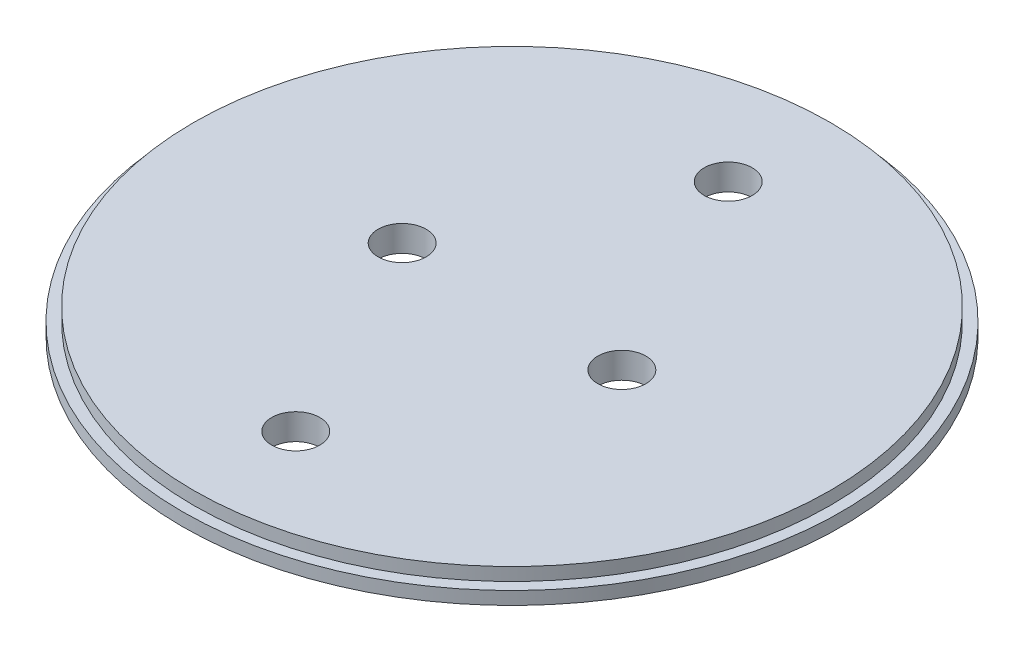
ISO-10303-21;
HEADER;
FILE_DESCRIPTION(('STEP AP214'),'2;1');
FILE_NAME('part.step','',(''),(''),'','','');
FILE_SCHEMA(('AUTOMOTIVE_DESIGN { 1 0 10303 214 1 1 1 1 }'));
ENDSEC;
DATA;
#1=APPLICATION_CONTEXT('core data for automotive mechanical design processes');
#2=APPLICATION_PROTOCOL_DEFINITION('international standard','automotive_design',2000,#1);
#3=PRODUCT_CONTEXT('',#1,'mechanical');
#4=PRODUCT('Part','Part','',(#3));
#5=PRODUCT_RELATED_PRODUCT_CATEGORY('part','',(#4));
#6=PRODUCT_DEFINITION_FORMATION('','',#4);
#7=PRODUCT_DEFINITION_CONTEXT('part definition',#1,'design');
#8=PRODUCT_DEFINITION('design','',#6,#7);
#9=PRODUCT_DEFINITION_SHAPE('','',#8);
#10=(LENGTH_UNIT() NAMED_UNIT(*) SI_UNIT(.MILLI.,.METRE.));
#11=(NAMED_UNIT(*) PLANE_ANGLE_UNIT() SI_UNIT($,.RADIAN.));
#12=(NAMED_UNIT(*) SI_UNIT($,.STERADIAN.) SOLID_ANGLE_UNIT());
#13=UNCERTAINTY_MEASURE_WITH_UNIT(LENGTH_MEASURE(1.E-05),#10,'distance_accuracy_value','');
#14=(GEOMETRIC_REPRESENTATION_CONTEXT(3) GLOBAL_UNCERTAINTY_ASSIGNED_CONTEXT((#13)) GLOBAL_UNIT_ASSIGNED_CONTEXT((#10,
#11,#12)) REPRESENTATION_CONTEXT('',''));
#15=CARTESIAN_POINT('',(0.,0.,0.));
#16=DIRECTION('',(0.,0.,1.));
#17=DIRECTION('',(1.,0.,0.));
#18=AXIS2_PLACEMENT_3D('',#15,#16,#17);
#19=CARTESIAN_POINT('',(0.,3.,50.));
#20=DIRECTION('',(0.,-1.,0.));
#21=DIRECTION('',(0.,0.,-1.));
#22=AXIS2_PLACEMENT_3D('',#19,#20,#21);
#23=CYLINDRICAL_SURFACE('',#22,5.55625);
#24=CARTESIAN_POINT('',(0.,3.,50.));
#25=DIRECTION('',(0.,1.,0.));
#26=DIRECTION('',(0.,0.,1.));
#27=AXIS2_PLACEMENT_3D('',#24,#25,#26);
#28=CIRCLE('',#27,5.55625);
#29=CARTESIAN_POINT('',(0.,3.,55.55625));
#30=VERTEX_POINT('',#29);
#31=EDGE_CURVE('E54',#30,#30,#28,.T.);
#32=ORIENTED_EDGE('',*,*,#31,.T.);
#33=EDGE_LOOP('',(#32));
#34=FACE_BOUND('',#33,.T.);
#35=CARTESIAN_POINT('',(0.,-3.,50.));
#36=DIRECTION('',(0.,1.,0.));
#37=DIRECTION('',(0.,0.,1.));
#38=AXIS2_PLACEMENT_3D('',#35,#36,#37);
#39=CIRCLE('',#38,5.55625);
#40=CARTESIAN_POINT('',(0.,-3.,55.55625));
#41=VERTEX_POINT('',#40);
#42=EDGE_CURVE('E82',#41,#41,#39,.T.);
#43=ORIENTED_EDGE('',*,*,#42,.F.);
#44=EDGE_LOOP('',(#43));
#45=FACE_BOUND('',#44,.T.);
#46=ADVANCED_FACE('F45',(#34,#45),#23,.F.);
#47=CARTESIAN_POINT('',(0.,3.,-50.));
#48=DIRECTION('',(0.,-1.,0.));
#49=DIRECTION('',(0.,0.,-1.));
#50=AXIS2_PLACEMENT_3D('',#47,#48,#49);
#51=CYLINDRICAL_SURFACE('',#50,5.55625);
#52=CARTESIAN_POINT('',(0.,3.,-50.));
#53=DIRECTION('',(0.,1.,0.));
#54=DIRECTION('',(0.,0.,1.));
#55=AXIS2_PLACEMENT_3D('',#52,#53,#54);
#56=CIRCLE('',#55,5.55625);
#57=CARTESIAN_POINT('',(0.,3.,-44.44375));
#58=VERTEX_POINT('',#57);
#59=EDGE_CURVE('E59',#58,#58,#56,.T.);
#60=ORIENTED_EDGE('',*,*,#59,.T.);
#61=EDGE_LOOP('',(#60));
#62=FACE_BOUND('',#61,.T.);
#63=CARTESIAN_POINT('',(0.,-3.,-50.));
#64=DIRECTION('',(0.,1.,0.));
#65=DIRECTION('',(0.,0.,1.));
#66=AXIS2_PLACEMENT_3D('',#63,#64,#65);
#67=CIRCLE('',#66,5.55625);
#68=CARTESIAN_POINT('',(0.,-3.,-44.44375));
#69=VERTEX_POINT('',#68);
#70=EDGE_CURVE('E86',#69,#69,#67,.T.);
#71=ORIENTED_EDGE('',*,*,#70,.F.);
#72=EDGE_LOOP('',(#71));
#73=FACE_BOUND('',#72,.T.);
#74=ADVANCED_FACE('F113',(#62,#73),#51,.F.);
#75=CARTESIAN_POINT('',(-25.4,3.,0.));
#76=DIRECTION('',(0.,-1.,0.));
#77=DIRECTION('',(0.,0.,-1.));
#78=AXIS2_PLACEMENT_3D('',#75,#76,#77);
#79=CYLINDRICAL_SURFACE('',#78,5.55625);
#80=CARTESIAN_POINT('',(-25.4,3.,0.));
#81=DIRECTION('',(0.,1.,0.));
#82=DIRECTION('',(0.,0.,1.));
#83=AXIS2_PLACEMENT_3D('',#80,#81,#82);
#84=CIRCLE('',#83,5.55625);
#85=CARTESIAN_POINT('',(-25.4,3.,5.55625));
#86=VERTEX_POINT('',#85);
#87=EDGE_CURVE('E65',#86,#86,#84,.T.);
#88=ORIENTED_EDGE('',*,*,#87,.T.);
#89=EDGE_LOOP('',(#88));
#90=FACE_BOUND('',#89,.T.);
#91=CARTESIAN_POINT('',(-25.4,-3.,0.));
#92=DIRECTION('',(0.,1.,0.));
#93=DIRECTION('',(0.,0.,1.));
#94=AXIS2_PLACEMENT_3D('',#91,#92,#93);
#95=CIRCLE('',#94,5.55625);
#96=CARTESIAN_POINT('',(-25.4,-3.,5.55625));
#97=VERTEX_POINT('',#96);
#98=EDGE_CURVE('E90',#97,#97,#95,.T.);
#99=ORIENTED_EDGE('',*,*,#98,.F.);
#100=EDGE_LOOP('',(#99));
#101=FACE_BOUND('',#100,.T.);
#102=ADVANCED_FACE('F103',(#90,#101),#79,.F.);
#103=CARTESIAN_POINT('',(25.4,3.,0.));
#104=DIRECTION('',(0.,-1.,0.));
#105=DIRECTION('',(0.,0.,-1.));
#106=AXIS2_PLACEMENT_3D('',#103,#104,#105);
#107=CYLINDRICAL_SURFACE('',#106,5.55625);
#108=CARTESIAN_POINT('',(25.4,3.,0.));
#109=DIRECTION('',(0.,1.,0.));
#110=DIRECTION('',(0.,0.,1.));
#111=AXIS2_PLACEMENT_3D('',#108,#109,#110);
#112=CIRCLE('',#111,5.55625);
#113=CARTESIAN_POINT('',(25.4,3.,5.55625));
#114=VERTEX_POINT('',#113);
#115=EDGE_CURVE('E69',#114,#114,#112,.T.);
#116=ORIENTED_EDGE('',*,*,#115,.T.);
#117=EDGE_LOOP('',(#116));
#118=FACE_BOUND('',#117,.T.);
#119=CARTESIAN_POINT('',(25.4,-3.,0.));
#120=DIRECTION('',(0.,1.,0.));
#121=DIRECTION('',(0.,0.,1.));
#122=AXIS2_PLACEMENT_3D('',#119,#120,#121);
#123=CIRCLE('',#122,5.55625);
#124=CARTESIAN_POINT('',(25.4,-3.,5.55625));
#125=VERTEX_POINT('',#124);
#126=EDGE_CURVE('E77',#125,#125,#123,.T.);
#127=ORIENTED_EDGE('',*,*,#126,.F.);
#128=EDGE_LOOP('',(#127));
#129=FACE_BOUND('',#128,.T.);
#130=ADVANCED_FACE('F47',(#118,#129),#107,.F.);
#131=CARTESIAN_POINT('',(0.,3.,0.));
#132=DIRECTION('',(0.,-1.,0.));
#133=DIRECTION('',(0.,0.,-1.));
#134=AXIS2_PLACEMENT_3D('',#131,#132,#133);
#135=CYLINDRICAL_SURFACE('',#134,73.65);
#136=CARTESIAN_POINT('',(0.,3.,0.));
#137=DIRECTION('',(0.,1.,0.));
#138=DIRECTION('',(0.,0.,1.));
#139=AXIS2_PLACEMENT_3D('',#136,#137,#138);
#140=CIRCLE('',#139,73.65);
#141=CARTESIAN_POINT('',(0.,3.,73.65));
#142=VERTEX_POINT('',#141);
#143=EDGE_CURVE('E10',#142,#142,#140,.T.);
#144=ORIENTED_EDGE('',*,*,#143,.F.);
#145=EDGE_LOOP('',(#144));
#146=FACE_BOUND('',#145,.T.);
#147=CARTESIAN_POINT('',(0.,0.,0.));
#148=DIRECTION('',(0.,1.,0.));
#149=DIRECTION('',(0.,0.,1.));
#150=AXIS2_PLACEMENT_3D('',#147,#148,#149);
#151=CIRCLE('',#150,73.65);
#152=CARTESIAN_POINT('',(0.,0.,73.65));
#153=VERTEX_POINT('',#152);
#154=EDGE_CURVE('E49',#153,#153,#151,.T.);
#155=ORIENTED_EDGE('',*,*,#154,.T.);
#156=EDGE_LOOP('',(#155));
#157=FACE_BOUND('',#156,.T.);
#158=ADVANCED_FACE('F102',(#146,#157),#135,.T.);
#159=CARTESIAN_POINT('',(0.,3.,0.));
#160=DIRECTION('',(0.,1.,0.));
#161=DIRECTION('',(0.,0.,1.));
#162=AXIS2_PLACEMENT_3D('',#159,#160,#161);
#163=PLANE('',#162);
#164=ORIENTED_EDGE('',*,*,#115,.F.);
#165=EDGE_LOOP('',(#164));
#166=FACE_BOUND('',#165,.T.);
#167=ORIENTED_EDGE('',*,*,#87,.F.);
#168=EDGE_LOOP('',(#167));
#169=FACE_BOUND('',#168,.T.);
#170=ORIENTED_EDGE('',*,*,#59,.F.);
#171=EDGE_LOOP('',(#170));
#172=FACE_BOUND('',#171,.T.);
#173=ORIENTED_EDGE('',*,*,#31,.F.);
#174=EDGE_LOOP('',(#173));
#175=FACE_BOUND('',#174,.T.);
#176=ORIENTED_EDGE('',*,*,#143,.T.);
#177=EDGE_LOOP('',(#176));
#178=FACE_BOUND('',#177,.T.);
#179=ADVANCED_FACE('F110',(#166,#169,#172,#175,#178),#163,.T.);
#180=CARTESIAN_POINT('',(0.,-3.,0.));
#181=DIRECTION('',(0.,1.,0.));
#182=DIRECTION('',(0.,0.,1.));
#183=AXIS2_PLACEMENT_3D('',#180,#181,#182);
#184=CYLINDRICAL_SURFACE('',#183,76.2);
#185=CARTESIAN_POINT('',(0.,-3.,0.));
#186=DIRECTION('',(0.,1.,0.));
#187=DIRECTION('',(0.,0.,1.));
#188=AXIS2_PLACEMENT_3D('',#185,#186,#187);
#189=CIRCLE('',#188,76.2);
#190=CARTESIAN_POINT('',(0.,-3.,76.2));
#191=VERTEX_POINT('',#190);
#192=EDGE_CURVE('E78',#191,#191,#189,.T.);
#193=ORIENTED_EDGE('',*,*,#192,.T.);
#194=EDGE_LOOP('',(#193));
#195=FACE_BOUND('',#194,.T.);
#196=CARTESIAN_POINT('',(0.,0.,0.));
#197=DIRECTION('',(0.,1.,0.));
#198=DIRECTION('',(0.,0.,1.));
#199=AXIS2_PLACEMENT_3D('',#196,#197,#198);
#200=CIRCLE('',#199,76.2);
#201=CARTESIAN_POINT('',(0.,0.,76.2));
#202=VERTEX_POINT('',#201);
#203=EDGE_CURVE('E73',#202,#202,#200,.T.);
#204=ORIENTED_EDGE('',*,*,#203,.F.);
#205=EDGE_LOOP('',(#204));
#206=FACE_BOUND('',#205,.T.);
#207=ADVANCED_FACE('F128',(#195,#206),#184,.T.);
#208=CARTESIAN_POINT('',(0.,-3.,0.));
#209=DIRECTION('',(0.,1.,0.));
#210=DIRECTION('',(0.,0.,1.));
#211=AXIS2_PLACEMENT_3D('',#208,#209,#210);
#212=PLANE('',#211);
#213=ORIENTED_EDGE('',*,*,#126,.T.);
#214=EDGE_LOOP('',(#213));
#215=FACE_BOUND('',#214,.T.);
#216=ORIENTED_EDGE('',*,*,#98,.T.);
#217=EDGE_LOOP('',(#216));
#218=FACE_BOUND('',#217,.T.);
#219=ORIENTED_EDGE('',*,*,#70,.T.);
#220=EDGE_LOOP('',(#219));
#221=FACE_BOUND('',#220,.T.);
#222=ORIENTED_EDGE('',*,*,#42,.T.);
#223=EDGE_LOOP('',(#222));
#224=FACE_BOUND('',#223,.T.);
#225=ORIENTED_EDGE('',*,*,#192,.F.);
#226=EDGE_LOOP('',(#225));
#227=FACE_BOUND('',#226,.T.);
#228=ADVANCED_FACE('F98',(#215,#218,#221,#224,#227),#212,.F.);
#229=CARTESIAN_POINT('',(0.,0.,0.));
#230=DIRECTION('',(0.,1.,0.));
#231=DIRECTION('',(0.,0.,1.));
#232=AXIS2_PLACEMENT_3D('',#229,#230,#231);
#233=PLANE('',#232);
#234=ORIENTED_EDGE('',*,*,#154,.F.);
#235=EDGE_LOOP('',(#234));
#236=FACE_BOUND('',#235,.T.);
#237=ORIENTED_EDGE('',*,*,#203,.T.);
#238=EDGE_LOOP('',(#237));
#239=FACE_BOUND('',#238,.T.);
#240=ADVANCED_FACE('F132',(#236,#239),#233,.T.);
#241=CLOSED_SHELL('',(#46,#74,#102,#130,#158,#179,#207,#228,#240));
#242=MANIFOLD_SOLID_BREP('B2',#241);
#243=ADVANCED_BREP_SHAPE_REPRESENTATION('',(#18,#242),#14);
#244=SHAPE_DEFINITION_REPRESENTATION(#9,#243);
ENDSEC;
END-ISO-10303-21;
